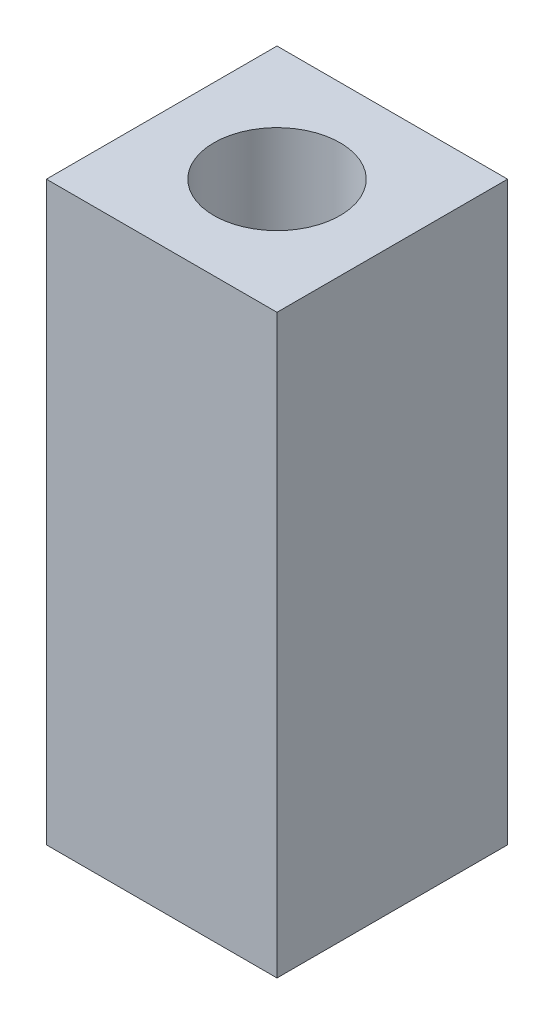
ISO-10303-21;
HEADER;
FILE_DESCRIPTION(('STEP AP214'),'2;1');
FILE_NAME('part.step','',(''),(''),'','','');
FILE_SCHEMA(('AUTOMOTIVE_DESIGN { 1 0 10303 214 1 1 1 1 }'));
ENDSEC;
DATA;
#1=APPLICATION_CONTEXT('core data for automotive mechanical design processes');
#2=APPLICATION_PROTOCOL_DEFINITION('international standard','automotive_design',2000,#1);
#3=PRODUCT_CONTEXT('',#1,'mechanical');
#4=PRODUCT('Part','Part','',(#3));
#5=PRODUCT_RELATED_PRODUCT_CATEGORY('part','',(#4));
#6=PRODUCT_DEFINITION_FORMATION('','',#4);
#7=PRODUCT_DEFINITION_CONTEXT('part definition',#1,'design');
#8=PRODUCT_DEFINITION('design','',#6,#7);
#9=PRODUCT_DEFINITION_SHAPE('','',#8);
#10=(LENGTH_UNIT() NAMED_UNIT(*) SI_UNIT(.MILLI.,.METRE.));
#11=(NAMED_UNIT(*) PLANE_ANGLE_UNIT() SI_UNIT($,.RADIAN.));
#12=(NAMED_UNIT(*) SI_UNIT($,.STERADIAN.) SOLID_ANGLE_UNIT());
#13=UNCERTAINTY_MEASURE_WITH_UNIT(LENGTH_MEASURE(1.E-05),#10,'distance_accuracy_value','');
#14=(GEOMETRIC_REPRESENTATION_CONTEXT(3) GLOBAL_UNCERTAINTY_ASSIGNED_CONTEXT((#13)) GLOBAL_UNIT_ASSIGNED_CONTEXT((#10,
#11,#12)) REPRESENTATION_CONTEXT('',''));
#15=CARTESIAN_POINT('',(0.,0.,0.));
#16=DIRECTION('',(0.,0.,1.));
#17=DIRECTION('',(1.,0.,0.));
#18=AXIS2_PLACEMENT_3D('',#15,#16,#17);
#19=CARTESIAN_POINT('',(25.,125.,25.));
#20=DIRECTION('',(-1.,0.,0.));
#21=DIRECTION('',(0.,0.,1.));
#22=AXIS2_PLACEMENT_3D('',#19,#20,#21);
#23=PLANE('',#22);
#24=DIRECTION('',(0.,0.,-1.));
#25=VECTOR('',#24,1.);
#26=CARTESIAN_POINT('',(25.,0.,25.));
#27=LINE('',#26,#25);
#28=CARTESIAN_POINT('',(25.,0.,25.));
#29=VERTEX_POINT('',#28);
#30=CARTESIAN_POINT('',(25.,0.,-25.));
#31=VERTEX_POINT('',#30);
#32=EDGE_CURVE('E101',#29,#31,#27,.T.);
#33=ORIENTED_EDGE('',*,*,#32,.T.);
#34=DIRECTION('',(0.,-1.,0.));
#35=VECTOR('',#34,1.);
#36=CARTESIAN_POINT('',(25.,125.,-25.));
#37=LINE('',#36,#35);
#38=CARTESIAN_POINT('',(25.,125.,-25.));
#39=VERTEX_POINT('',#38);
#40=EDGE_CURVE('E11',#39,#31,#37,.T.);
#41=ORIENTED_EDGE('',*,*,#40,.F.);
#42=DIRECTION('',(0.,0.,-1.));
#43=VECTOR('',#42,1.);
#44=CARTESIAN_POINT('',(25.,125.,25.));
#45=LINE('',#44,#43);
#46=CARTESIAN_POINT('',(25.,125.,25.));
#47=VERTEX_POINT('',#46);
#48=EDGE_CURVE('E89',#47,#39,#45,.T.);
#49=ORIENTED_EDGE('',*,*,#48,.F.);
#50=DIRECTION('',(0.,-1.,0.));
#51=VECTOR('',#50,1.);
#52=CARTESIAN_POINT('',(25.,125.,25.));
#53=LINE('',#52,#51);
#54=EDGE_CURVE('E97',#47,#29,#53,.T.);
#55=ORIENTED_EDGE('',*,*,#54,.T.);
#56=EDGE_LOOP('',(#33,#41,#49,#55));
#57=FACE_BOUND('',#56,.T.);
#58=ADVANCED_FACE('F38',(#57),#23,.F.);
#59=CARTESIAN_POINT('',(-25.,125.,-25.));
#60=DIRECTION('',(0.,0.,1.));
#61=DIRECTION('',(1.,0.,0.));
#62=AXIS2_PLACEMENT_3D('',#59,#60,#61);
#63=PLANE('',#62);
#64=DIRECTION('',(-1.,0.,0.));
#65=VECTOR('',#64,1.);
#66=CARTESIAN_POINT('',(-25.,0.,-25.));
#67=LINE('',#66,#65);
#68=CARTESIAN_POINT('',(-25.,0.,-25.));
#69=VERTEX_POINT('',#68);
#70=EDGE_CURVE('E93',#31,#69,#67,.T.);
#71=ORIENTED_EDGE('',*,*,#70,.T.);
#72=DIRECTION('',(0.,-1.,0.));
#73=VECTOR('',#72,1.);
#74=CARTESIAN_POINT('',(-25.,125.,-25.));
#75=LINE('',#74,#73);
#76=CARTESIAN_POINT('',(-25.,125.,-25.));
#77=VERTEX_POINT('',#76);
#78=EDGE_CURVE('E46',#77,#69,#75,.T.);
#79=ORIENTED_EDGE('',*,*,#78,.F.);
#80=DIRECTION('',(-1.,0.,0.));
#81=VECTOR('',#80,1.);
#82=CARTESIAN_POINT('',(-25.,125.,-25.));
#83=LINE('',#82,#81);
#84=EDGE_CURVE('E84',#39,#77,#83,.T.);
#85=ORIENTED_EDGE('',*,*,#84,.F.);
#86=ORIENTED_EDGE('',*,*,#40,.T.);
#87=EDGE_LOOP('',(#71,#79,#85,#86));
#88=FACE_BOUND('',#87,.T.);
#89=ADVANCED_FACE('F92',(#88),#63,.F.);
#90=CARTESIAN_POINT('',(-25.,125.,25.));
#91=DIRECTION('',(1.,0.,0.));
#92=DIRECTION('',(0.,0.,-1.));
#93=AXIS2_PLACEMENT_3D('',#90,#91,#92);
#94=PLANE('',#93);
#95=CARTESIAN_POINT('',(-25.,86.74,0.));
#96=DIRECTION('',(-1.,0.,0.));
#97=DIRECTION('',(0.,0.,1.));
#98=AXIS2_PLACEMENT_3D('',#95,#96,#97);
#99=CIRCLE('',#98,2.5);
#100=CARTESIAN_POINT('',(-25.,86.74,2.5));
#101=VERTEX_POINT('',#100);
#102=EDGE_CURVE('E123',#101,#101,#99,.T.);
#103=ORIENTED_EDGE('',*,*,#102,.F.);
#104=EDGE_LOOP('',(#103));
#105=FACE_BOUND('',#104,.T.);
#106=DIRECTION('',(0.,0.,1.));
#107=VECTOR('',#106,1.);
#108=CARTESIAN_POINT('',(-25.,0.,25.));
#109=LINE('',#108,#107);
#110=CARTESIAN_POINT('',(-25.,0.,25.));
#111=VERTEX_POINT('',#110);
#112=EDGE_CURVE('E71',#69,#111,#109,.T.);
#113=ORIENTED_EDGE('',*,*,#112,.T.);
#114=DIRECTION('',(0.,-1.,0.));
#115=VECTOR('',#114,1.);
#116=CARTESIAN_POINT('',(-25.,125.,25.));
#117=LINE('',#116,#115);
#118=CARTESIAN_POINT('',(-25.,125.,25.));
#119=VERTEX_POINT('',#118);
#120=EDGE_CURVE('E94',#119,#111,#117,.T.);
#121=ORIENTED_EDGE('',*,*,#120,.F.);
#122=DIRECTION('',(0.,0.,1.));
#123=VECTOR('',#122,1.);
#124=CARTESIAN_POINT('',(-25.,125.,25.));
#125=LINE('',#124,#123);
#126=EDGE_CURVE('E87',#77,#119,#125,.T.);
#127=ORIENTED_EDGE('',*,*,#126,.F.);
#128=ORIENTED_EDGE('',*,*,#78,.T.);
#129=EDGE_LOOP('',(#113,#121,#127,#128));
#130=FACE_BOUND('',#129,.T.);
#131=ADVANCED_FACE('F95',(#105,#130),#94,.F.);
#132=CARTESIAN_POINT('',(-25.,125.,25.));
#133=DIRECTION('',(0.,0.,-1.));
#134=DIRECTION('',(-1.,0.,0.));
#135=AXIS2_PLACEMENT_3D('',#132,#133,#134);
#136=PLANE('',#135);
#137=DIRECTION('',(1.,0.,0.));
#138=VECTOR('',#137,1.);
#139=CARTESIAN_POINT('',(-25.,0.,25.));
#140=LINE('',#139,#138);
#141=EDGE_CURVE('E77',#111,#29,#140,.T.);
#142=ORIENTED_EDGE('',*,*,#141,.T.);
#143=ORIENTED_EDGE('',*,*,#54,.F.);
#144=DIRECTION('',(1.,0.,0.));
#145=VECTOR('',#144,1.);
#146=CARTESIAN_POINT('',(-25.,125.,25.));
#147=LINE('',#146,#145);
#148=EDGE_CURVE('E54',#119,#47,#147,.T.);
#149=ORIENTED_EDGE('',*,*,#148,.F.);
#150=ORIENTED_EDGE('',*,*,#120,.T.);
#151=EDGE_LOOP('',(#142,#143,#149,#150));
#152=FACE_BOUND('',#151,.T.);
#153=ADVANCED_FACE('F109',(#152),#136,.F.);
#154=CARTESIAN_POINT('',(0.,125.,0.));
#155=DIRECTION('',(0.,-1.,0.));
#156=DIRECTION('',(0.,0.,-1.));
#157=AXIS2_PLACEMENT_3D('',#154,#155,#156);
#158=PLANE('',#157);
#159=CARTESIAN_POINT('',(0.,125.,0.));
#160=DIRECTION('',(0.,1.,0.));
#161=DIRECTION('',(-1.,0.,0.));
#162=AXIS2_PLACEMENT_3D('',#159,#160,#161);
#163=CIRCLE('',#162,13.6824088833462);
#164=CARTESIAN_POINT('',(-13.6824088833462,125.,0.));
#165=VERTEX_POINT('',#164);
#166=EDGE_CURVE('E120',#165,#165,#163,.T.);
#167=ORIENTED_EDGE('',*,*,#166,.F.);
#168=EDGE_LOOP('',(#167));
#169=FACE_BOUND('',#168,.T.);
#170=ORIENTED_EDGE('',*,*,#48,.T.);
#171=ORIENTED_EDGE('',*,*,#84,.T.);
#172=ORIENTED_EDGE('',*,*,#126,.T.);
#173=ORIENTED_EDGE('',*,*,#148,.T.);
#174=EDGE_LOOP('',(#170,#171,#172,#173));
#175=FACE_BOUND('',#174,.T.);
#176=ADVANCED_FACE('F85',(#169,#175),#158,.F.);
#177=CARTESIAN_POINT('',(0.,0.,0.));
#178=DIRECTION('',(0.,-1.,0.));
#179=DIRECTION('',(0.,0.,-1.));
#180=AXIS2_PLACEMENT_3D('',#177,#178,#179);
#181=PLANE('',#180);
#182=ORIENTED_EDGE('',*,*,#32,.F.);
#183=ORIENTED_EDGE('',*,*,#141,.F.);
#184=ORIENTED_EDGE('',*,*,#112,.F.);
#185=ORIENTED_EDGE('',*,*,#70,.F.);
#186=EDGE_LOOP('',(#182,#183,#184,#185));
#187=FACE_BOUND('',#186,.T.);
#188=ADVANCED_FACE('F112',(#187),#181,.T.);
#189=CARTESIAN_POINT('',(0.,25.,0.));
#190=DIRECTION('',(0.,1.,0.));
#191=DIRECTION('',(-1.,0.,0.));
#192=AXIS2_PLACEMENT_3D('',#189,#190,#191);
#193=PLANE('',#192);
#194=CARTESIAN_POINT('',(0.,25.,0.));
#195=DIRECTION('',(0.,1.,0.));
#196=DIRECTION('',(-1.,0.,0.));
#197=AXIS2_PLACEMENT_3D('',#194,#195,#196);
#198=CIRCLE('',#197,5.);
#199=CARTESIAN_POINT('',(-4.99999999999999,25.,0.));
#200=VERTEX_POINT('',#199);
#201=EDGE_CURVE('E104',#200,#200,#198,.T.);
#202=ORIENTED_EDGE('',*,*,#201,.T.);
#203=EDGE_LOOP('',(#202));
#204=FACE_BOUND('',#203,.T.);
#205=ADVANCED_FACE('F145',(#204),#193,.T.);
#206=CARTESIAN_POINT('',(0.,25.,0.));
#207=DIRECTION('',(0.,1.,0.));
#208=DIRECTION('',(-1.,0.,0.));
#209=AXIS2_PLACEMENT_3D('',#206,#207,#208);
#210=CONICAL_SURFACE('',#209,5.,0.174532925199426);
#211=CARTESIAN_POINT('',(0.,74.2403876506105,0.));
#212=DIRECTION('',(0.,1.,0.));
#213=DIRECTION('',(-1.,0.,0.));
#214=AXIS2_PLACEMENT_3D('',#211,#212,#213);
#215=CIRCLE('',#214,13.6824088833462);
#216=CARTESIAN_POINT('',(-13.6824088833462,74.2403876506105,0.));
#217=VERTEX_POINT('',#216);
#218=EDGE_CURVE('E117',#217,#217,#215,.T.);
#219=ORIENTED_EDGE('',*,*,#218,.T.);
#220=EDGE_LOOP('',(#219));
#221=FACE_BOUND('',#220,.T.);
#222=ORIENTED_EDGE('',*,*,#201,.F.);
#223=EDGE_LOOP('',(#222));
#224=FACE_BOUND('',#223,.T.);
#225=ADVANCED_FACE('F141',(#221,#224),#210,.F.);
#226=CARTESIAN_POINT('',(0.,125.,0.));
#227=DIRECTION('',(0.,1.,0.));
#228=DIRECTION('',(-1.,0.,0.));
#229=AXIS2_PLACEMENT_3D('',#226,#227,#228);
#230=CYLINDRICAL_SURFACE('',#229,13.6824088833462);
#231=CARTESIAN_POINT('',(-13.4520746671683,86.74,2.5));
#232=CARTESIAN_POINT('',(-13.4520773247936,86.8791627040584,2.49999459665392));
#233=CARTESIAN_POINT('',(-13.4542575790204,87.0183962847663,2.48834083829868));
#234=CARTESIAN_POINT('',(-13.4627328685214,87.2929420524355,2.44206245297423));
#235=CARTESIAN_POINT('',(-13.4690314670774,87.4282507375151,2.4074179335059));
#236=CARTESIAN_POINT('',(-13.4850068049517,87.6909343536773,2.31625354749389));
#237=CARTESIAN_POINT('',(-13.4946804744435,87.8183163708862,2.25975355473589));
#238=CARTESIAN_POINT('',(-13.5163123445382,88.0617839719815,2.1265339806864));
#239=CARTESIAN_POINT('',(-13.5282703480909,88.1778705289288,2.0498161432006));
#240=CARTESIAN_POINT('',(-13.5532814609023,88.39683441814,1.87737158050678));
#241=CARTESIAN_POINT('',(-13.5663448285883,88.4995588025449,1.78145210691563));
#242=CARTESIAN_POINT('',(-13.5920040307106,88.6875507657989,1.57374366211034));
#243=CARTESIAN_POINT('',(-13.604599835146,88.7728172260559,1.46195367479179));
#244=CARTESIAN_POINT('',(-13.6280142980712,88.9240562234796,1.22467605229161));
#245=CARTESIAN_POINT('',(-13.6388194664566,88.9898849874043,1.09909533203503));
#246=CARTESIAN_POINT('',(-13.6573205372471,89.0994541941313,0.838426876922858));
#247=CARTESIAN_POINT('',(-13.6650166823887,89.1431963614084,0.703339885235528));
#248=CARTESIAN_POINT('',(-13.6763601106862,89.2068789441488,0.429077426005651));
#249=CARTESIAN_POINT('',(-13.6800511911263,89.2270770107388,0.289963625251693));
#250=CARTESIAN_POINT('',(-13.6831194493947,89.2439004583709,0.0102761178703391));
#251=CARTESIAN_POINT('',(-13.6824969768277,89.2405277497759,-0.130297469522266));
#252=CARTESIAN_POINT('',(-13.6770425972013,89.2105037846068,-0.407148512732744));
#253=CARTESIAN_POINT('',(-13.6722608522201,89.1841299189444,-0.543457181761237));
#254=CARTESIAN_POINT('',(-13.6590813767233,89.1092905518237,-0.809681159928835));
#255=CARTESIAN_POINT('',(-13.6506835193977,89.0608242756246,-0.939596244679524));
#256=CARTESIAN_POINT('',(-13.6311311731422,88.942908856004,-1.19015470897773));
#257=CARTESIAN_POINT('',(-13.6199620684352,88.8733480114008,-1.31074433369086));
#258=CARTESIAN_POINT('',(-13.5961038063004,88.7153002194746,-1.53864326993394));
#259=CARTESIAN_POINT('',(-13.5834145018532,88.6268114409698,-1.64595129494955));
#260=CARTESIAN_POINT('',(-13.5577045696331,88.4318886535597,-1.84588341640423));
#261=CARTESIAN_POINT('',(-13.5446818081151,88.3252120122637,-1.93827084003687));
#262=CARTESIAN_POINT('',(-13.5199498956025,88.0977521126746,-2.10387737091811));
#263=CARTESIAN_POINT('',(-13.5082407619662,87.9769686680178,-2.17709622489084));
#264=CARTESIAN_POINT('',(-13.4874592012822,87.7244194268511,-2.30234960811747));
#265=CARTESIAN_POINT('',(-13.4783908846902,87.5926369160179,-2.35435116237243));
#266=CARTESIAN_POINT('',(-13.4639817472249,87.3220029667366,-2.43540962579492));
#267=CARTESIAN_POINT('',(-13.4586405268728,87.1831522875836,-2.46446899400344));
#268=CARTESIAN_POINT('',(-13.452368972865,86.9044536732269,-2.49847560176222));
#269=CARTESIAN_POINT('',(-13.4513765588487,86.7646485055063,-2.50376223223437));
#270=CARTESIAN_POINT('',(-13.4537490415827,86.4861526408055,-2.49098179380125));
#271=CARTESIAN_POINT('',(-13.4571137342724,86.3474618919388,-2.472915818592));
#272=CARTESIAN_POINT('',(-13.4677635993725,86.0762384894538,-2.41423388642112));
#273=CARTESIAN_POINT('',(-13.4750180413397,85.9436662949634,-2.37379460808703));
#274=CARTESIAN_POINT('',(-13.4926037039932,85.6871795271498,-2.27170093349882));
#275=CARTESIAN_POINT('',(-13.5029351414153,85.5632655644503,-2.21004504275151));
#276=CARTESIAN_POINT('',(-13.5256527647438,85.3261138726728,-2.06648245066515));
#277=CARTESIAN_POINT('',(-13.5380602874444,85.2130084633019,-1.98436060932211));
#278=CARTESIAN_POINT('',(-13.5634714870607,85.0020607387246,-1.80248859350753));
#279=CARTESIAN_POINT('',(-13.5764752146902,84.9042197250481,-1.70273691736004));
#280=CARTESIAN_POINT('',(-13.6018123818227,84.7253170536338,-1.48692388099661));
#281=CARTESIAN_POINT('',(-13.6141352672608,84.6444831964955,-1.37067224814517));
#282=CARTESIAN_POINT('',(-13.636546762423,84.5034942191467,-1.12604165793326));
#283=CARTESIAN_POINT('',(-13.6466354550621,84.4433383314929,-0.997663150875644));
#284=CARTESIAN_POINT('',(-13.6633963388161,84.3457571608414,-0.733063699431736));
#285=CARTESIAN_POINT('',(-13.6700855804676,84.3082182587194,-0.596885783611802));
#286=CARTESIAN_POINT('',(-13.6793664500644,84.2565732042406,-0.32002481087535));
#287=CARTESIAN_POINT('',(-13.6819584864953,84.2424647158975,-0.179342204497134));
#288=CARTESIAN_POINT('',(-13.6827453336794,84.2381589386737,0.100346767734727));
#289=CARTESIAN_POINT('',(-13.6810035261683,84.2476169959463,0.239347767508888));
#290=CARTESIAN_POINT('',(-13.6734495434116,84.2894232297004,0.513744968569979));
#291=CARTESIAN_POINT('',(-13.6676374030327,84.3217712101057,0.649141200725237));
#292=CARTESIAN_POINT('',(-13.6525951158978,84.4082968397755,0.912315333907297));
#293=CARTESIAN_POINT('',(-13.6433704409943,84.4624395543041,1.04010505290011));
#294=CARTESIAN_POINT('',(-13.6225036656776,84.5909771822272,1.2848380887743));
#295=CARTESIAN_POINT('',(-13.6108614143461,84.665373360044,1.40178072786196));
#296=CARTESIAN_POINT('',(-13.5862452688964,84.8335010067675,1.62322212152187));
#297=CARTESIAN_POINT('',(-13.5732553800166,84.9274823197147,1.72752942769578));
#298=CARTESIAN_POINT('',(-13.547511227757,85.1315923701324,1.91901277319691));
#299=CARTESIAN_POINT('',(-13.5347570204176,85.2417248937974,2.00618478439434));
#300=CARTESIAN_POINT('',(-13.5108071877286,85.4761576765327,2.16163345304741));
#301=CARTESIAN_POINT('',(-13.499626113182,85.6005730362755,2.22973882741065));
#302=CARTESIAN_POINT('',(-13.4802627415564,85.8592410007913,2.34397396771417));
#303=CARTESIAN_POINT('',(-13.4720775756836,85.9934840462276,2.39012476946759));
#304=CARTESIAN_POINT('',(-13.4613657546368,86.2301293045953,2.44960572226584));
#305=CARTESIAN_POINT('',(-13.4579019661558,86.3311339442096,2.46847169389446));
#306=CARTESIAN_POINT('',(-13.4532554706182,86.5347462289588,2.49367066987564));
#307=CARTESIAN_POINT('',(-13.4520727069085,86.6373538342175,2.50000398549856));
#308=CARTESIAN_POINT('',(-13.4520746671683,86.74,2.5));
#309=B_SPLINE_CURVE_WITH_KNOTS('',3,(#231,#232,#233,#234,#235,#236,#237,#238,#239,#240,#241,
#242,#243,#244,#245,#246,#247,#248,#249,#250,#251,#252,#253,#254,#255,#256,#257,#258,#259,#260,
#261,#262,#263,#264,#265,#266,#267,#268,#269,#270,#271,#272,#273,#274,#275,#276,#277,#278,#279,
#280,#281,#282,#283,#284,#285,#286,#287,#288,#289,#290,#291,#292,#293,#294,#295,#296,#297,#298,
#299,#300,#301,#302,#303,#304,#305,#306,#307,#308),.UNSPECIFIED.,.T.,.F.,(4,2,2,2,2,2,2,2,2,2,2,
2,2,2,2,2,2,2,2,2,2,2,2,2,2,2,2,2,2,2,2,2,2,2,2,2,2,2,4),(0.,0.41711254574062,0.834586464822391,
1.25168165236473,1.66874087687226,2.09021791067303,2.51172194158246,2.93626977195719,
3.36078444940543,3.78060855947412,4.20039864405391,4.61519504925668,5.03000600173468,
5.44705301990485,5.86414040352595,6.28730353478672,6.71047225705406,7.13429616723097,
7.55807464399044,7.9757834438606,8.39347268146407,8.80790962093073,9.22237575921567,
9.64139754717798,10.0604550438394,10.4848111145528,10.9091514339943,11.3313418584765,
11.7534901885136,12.1695010619534,12.5855083718645,13.0008515029522,13.4162205698292,
13.8372541198827,14.2583865275783,14.6831888827249,15.1075833888154,15.4152525106163,
15.7229139908221),.UNSPECIFIED.);
#310=CARTESIAN_POINT('',(-13.4520746671683,86.74,2.5));
#311=VERTEX_POINT('',#310);
#312=EDGE_CURVE('E124',#311,#311,#309,.T.);
#313=ORIENTED_EDGE('',*,*,#312,.T.);
#314=EDGE_LOOP('',(#313));
#315=FACE_BOUND('',#314,.T.);
#316=ORIENTED_EDGE('',*,*,#166,.T.);
#317=EDGE_LOOP('',(#316));
#318=FACE_BOUND('',#317,.T.);
#319=ORIENTED_EDGE('',*,*,#218,.F.);
#320=EDGE_LOOP('',(#319));
#321=FACE_BOUND('',#320,.T.);
#322=ADVANCED_FACE('F137',(#315,#318,#321),#230,.F.);
#323=CARTESIAN_POINT('',(25.001,86.74,0.));
#324=DIRECTION('',(-1.,0.,0.));
#325=DIRECTION('',(0.,0.,1.));
#326=AXIS2_PLACEMENT_3D('',#323,#324,#325);
#327=CYLINDRICAL_SURFACE('',#326,2.5);
#328=ORIENTED_EDGE('',*,*,#312,.F.);
#329=EDGE_LOOP('',(#328));
#330=FACE_BOUND('',#329,.T.);
#331=ORIENTED_EDGE('',*,*,#102,.T.);
#332=EDGE_LOOP('',(#331));
#333=FACE_BOUND('',#332,.T.);
#334=ADVANCED_FACE('F132',(#330,#333),#327,.F.);
#335=CLOSED_SHELL('',(#58,#89,#131,#153,#176,#188,#205,#225,#322,#334));
#336=MANIFOLD_SOLID_BREP('B2',#335);
#337=ADVANCED_BREP_SHAPE_REPRESENTATION('',(#18,#336),#14);
#338=SHAPE_DEFINITION_REPRESENTATION(#9,#337);
ENDSEC;
END-ISO-10303-21;
